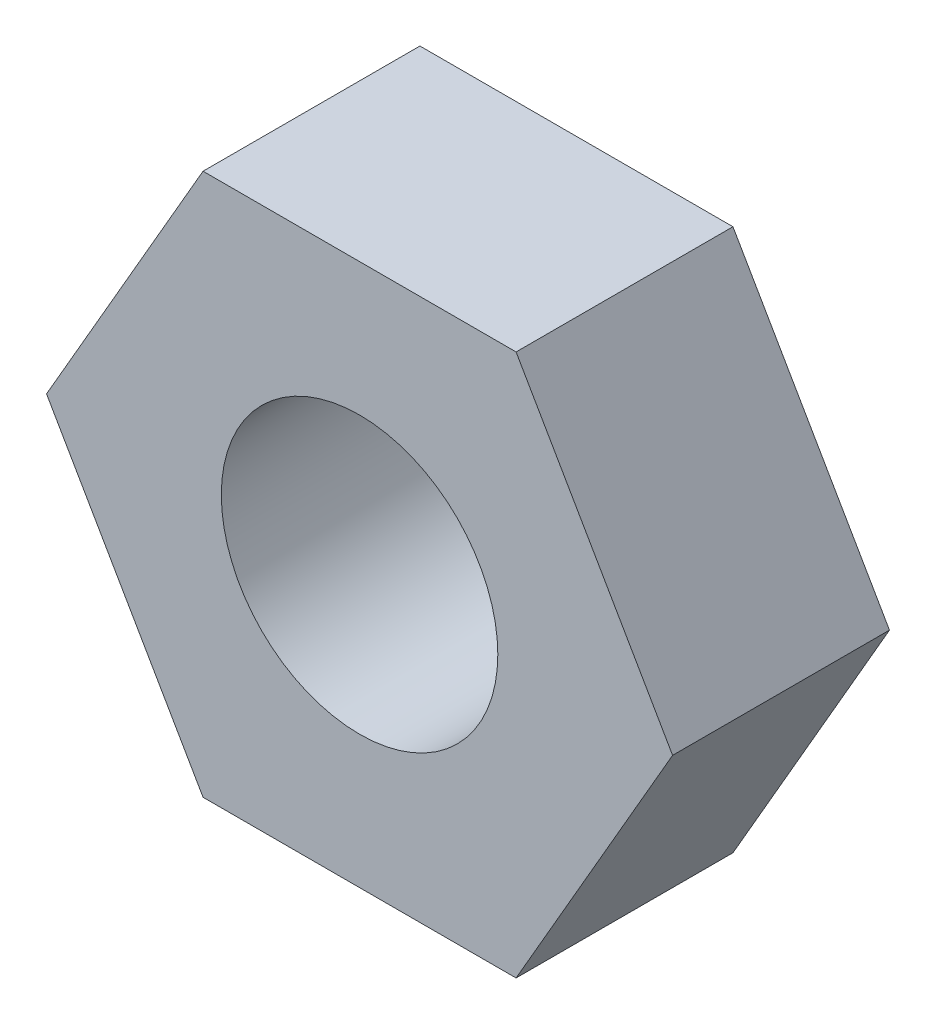
ISO-10303-21;
HEADER;
FILE_DESCRIPTION(('STEP AP214'),'2;1');
FILE_NAME('part.step','',(''),(''),'','','');
FILE_SCHEMA(('AUTOMOTIVE_DESIGN { 1 0 10303 214 1 1 1 1 }'));
ENDSEC;
DATA;
#1=APPLICATION_CONTEXT('core data for automotive mechanical design processes');
#2=APPLICATION_PROTOCOL_DEFINITION('international standard','automotive_design',2000,#1);
#3=PRODUCT_CONTEXT('',#1,'mechanical');
#4=PRODUCT('Part','Part','',(#3));
#5=PRODUCT_RELATED_PRODUCT_CATEGORY('part','',(#4));
#6=PRODUCT_DEFINITION_FORMATION('','',#4);
#7=PRODUCT_DEFINITION_CONTEXT('part definition',#1,'design');
#8=PRODUCT_DEFINITION('design','',#6,#7);
#9=PRODUCT_DEFINITION_SHAPE('','',#8);
#10=(LENGTH_UNIT() NAMED_UNIT(*) SI_UNIT(.MILLI.,.METRE.));
#11=(NAMED_UNIT(*) PLANE_ANGLE_UNIT() SI_UNIT($,.RADIAN.));
#12=(NAMED_UNIT(*) SI_UNIT($,.STERADIAN.) SOLID_ANGLE_UNIT());
#13=UNCERTAINTY_MEASURE_WITH_UNIT(LENGTH_MEASURE(1.E-05),#10,'distance_accuracy_value','');
#14=(GEOMETRIC_REPRESENTATION_CONTEXT(3) GLOBAL_UNCERTAINTY_ASSIGNED_CONTEXT((#13)) GLOBAL_UNIT_ASSIGNED_CONTEXT((#10,
#11,#12)) REPRESENTATION_CONTEXT('',''));
#15=CARTESIAN_POINT('',(0.,0.,0.));
#16=DIRECTION('',(0.,0.,1.));
#17=DIRECTION('',(1.,0.,0.));
#18=AXIS2_PLACEMENT_3D('',#15,#16,#17);
#19=CARTESIAN_POINT('',(1.15470053837925,-2.,1.6));
#20=DIRECTION('',(-0.866025403784439,0.5,0.));
#21=DIRECTION('',(-0.5,-0.866025403784439,0.));
#22=AXIS2_PLACEMENT_3D('',#19,#20,#21);
#23=PLANE('',#22);
#24=DIRECTION('',(0.5,0.866025403784439,0.));
#25=VECTOR('',#24,1.);
#26=CARTESIAN_POINT('',(1.15470053837925,-2.,0.));
#27=LINE('',#26,#25);
#28=CARTESIAN_POINT('',(1.15470053837925,-2.,0.));
#29=VERTEX_POINT('',#28);
#30=CARTESIAN_POINT('',(2.3094010767585,0.,0.));
#31=VERTEX_POINT('',#30);
#32=EDGE_CURVE('E128',#29,#31,#27,.T.);
#33=ORIENTED_EDGE('',*,*,#32,.T.);
#34=DIRECTION('',(0.,0.,-1.));
#35=VECTOR('',#34,1.);
#36=CARTESIAN_POINT('',(2.3094010767585,0.,1.6));
#37=LINE('',#36,#35);
#38=CARTESIAN_POINT('',(2.3094010767585,0.,1.6));
#39=VERTEX_POINT('',#38);
#40=EDGE_CURVE('E11',#39,#31,#37,.T.);
#41=ORIENTED_EDGE('',*,*,#40,.F.);
#42=DIRECTION('',(0.5,0.866025403784439,0.));
#43=VECTOR('',#42,1.);
#44=CARTESIAN_POINT('',(1.15470053837925,-2.,1.6));
#45=LINE('',#44,#43);
#46=CARTESIAN_POINT('',(1.15470053837925,-2.,1.6));
#47=VERTEX_POINT('',#46);
#48=EDGE_CURVE('E139',#47,#39,#45,.T.);
#49=ORIENTED_EDGE('',*,*,#48,.F.);
#50=DIRECTION('',(0.,0.,-1.));
#51=VECTOR('',#50,1.);
#52=CARTESIAN_POINT('',(1.15470053837925,-2.,1.6));
#53=LINE('',#52,#51);
#54=EDGE_CURVE('E124',#47,#29,#53,.T.);
#55=ORIENTED_EDGE('',*,*,#54,.T.);
#56=EDGE_LOOP('',(#33,#41,#49,#55));
#57=FACE_BOUND('',#56,.T.);
#58=ADVANCED_FACE('F43',(#57),#23,.F.);
#59=CARTESIAN_POINT('',(2.3094010767585,0.,1.6));
#60=DIRECTION('',(-0.866025403784439,-0.5,0.));
#61=DIRECTION('',(0.5,-0.866025403784439,0.));
#62=AXIS2_PLACEMENT_3D('',#59,#60,#61);
#63=PLANE('',#62);
#64=DIRECTION('',(-0.5,0.866025403784439,0.));
#65=VECTOR('',#64,1.);
#66=CARTESIAN_POINT('',(2.3094010767585,0.,0.));
#67=LINE('',#66,#65);
#68=CARTESIAN_POINT('',(1.15470053837925,2.,0.));
#69=VERTEX_POINT('',#68);
#70=EDGE_CURVE('E131',#31,#69,#67,.T.);
#71=ORIENTED_EDGE('',*,*,#70,.T.);
#72=DIRECTION('',(0.,0.,-1.));
#73=VECTOR('',#72,1.);
#74=CARTESIAN_POINT('',(1.15470053837925,2.,1.6));
#75=LINE('',#74,#73);
#76=CARTESIAN_POINT('',(1.15470053837925,2.,1.6));
#77=VERTEX_POINT('',#76);
#78=EDGE_CURVE('E52',#77,#69,#75,.T.);
#79=ORIENTED_EDGE('',*,*,#78,.F.);
#80=DIRECTION('',(-0.5,0.866025403784439,0.));
#81=VECTOR('',#80,1.);
#82=CARTESIAN_POINT('',(2.3094010767585,0.,1.6));
#83=LINE('',#82,#81);
#84=EDGE_CURVE('E97',#39,#77,#83,.T.);
#85=ORIENTED_EDGE('',*,*,#84,.F.);
#86=ORIENTED_EDGE('',*,*,#40,.T.);
#87=EDGE_LOOP('',(#71,#79,#85,#86));
#88=FACE_BOUND('',#87,.T.);
#89=ADVANCED_FACE('F165',(#88),#63,.F.);
#90=CARTESIAN_POINT('',(1.15470053837925,2.,1.6));
#91=DIRECTION('',(0.,-1.,0.));
#92=DIRECTION('',(1.,0.,0.));
#93=AXIS2_PLACEMENT_3D('',#90,#91,#92);
#94=PLANE('',#93);
#95=DIRECTION('',(-1.,0.,0.));
#96=VECTOR('',#95,1.);
#97=CARTESIAN_POINT('',(1.15470053837925,2.,0.));
#98=LINE('',#97,#96);
#99=CARTESIAN_POINT('',(-1.15470053837925,2.,0.));
#100=VERTEX_POINT('',#99);
#101=EDGE_CURVE('E134',#69,#100,#98,.T.);
#102=ORIENTED_EDGE('',*,*,#101,.T.);
#103=DIRECTION('',(0.,0.,-1.));
#104=VECTOR('',#103,1.);
#105=CARTESIAN_POINT('',(-1.15470053837925,2.,1.6));
#106=LINE('',#105,#104);
#107=CARTESIAN_POINT('',(-1.15470053837925,2.,1.6));
#108=VERTEX_POINT('',#107);
#109=EDGE_CURVE('E119',#108,#100,#106,.T.);
#110=ORIENTED_EDGE('',*,*,#109,.F.);
#111=DIRECTION('',(-1.,0.,0.));
#112=VECTOR('',#111,1.);
#113=CARTESIAN_POINT('',(1.15470053837925,2.,1.6));
#114=LINE('',#113,#112);
#115=EDGE_CURVE('E110',#77,#108,#114,.T.);
#116=ORIENTED_EDGE('',*,*,#115,.F.);
#117=ORIENTED_EDGE('',*,*,#78,.T.);
#118=EDGE_LOOP('',(#102,#110,#116,#117));
#119=FACE_BOUND('',#118,.T.);
#120=ADVANCED_FACE('F146',(#119),#94,.F.);
#121=CARTESIAN_POINT('',(-1.15470053837925,2.,1.6));
#122=DIRECTION('',(0.866025403784438,-0.5,0.));
#123=DIRECTION('',(0.5,0.866025403784439,0.));
#124=AXIS2_PLACEMENT_3D('',#121,#122,#123);
#125=PLANE('',#124);
#126=DIRECTION('',(-0.5,-0.866025403784438,0.));
#127=VECTOR('',#126,1.);
#128=CARTESIAN_POINT('',(-1.15470053837925,2.,0.));
#129=LINE('',#128,#127);
#130=CARTESIAN_POINT('',(-2.3094010767585,0.,0.));
#131=VERTEX_POINT('',#130);
#132=EDGE_CURVE('E118',#100,#131,#129,.T.);
#133=ORIENTED_EDGE('',*,*,#132,.T.);
#134=DIRECTION('',(0.,0.,-1.));
#135=VECTOR('',#134,1.);
#136=CARTESIAN_POINT('',(-2.3094010767585,0.,1.6));
#137=LINE('',#136,#135);
#138=CARTESIAN_POINT('',(-2.3094010767585,0.,1.6));
#139=VERTEX_POINT('',#138);
#140=EDGE_CURVE('E115',#139,#131,#137,.T.);
#141=ORIENTED_EDGE('',*,*,#140,.F.);
#142=DIRECTION('',(-0.5,-0.866025403784438,0.));
#143=VECTOR('',#142,1.);
#144=CARTESIAN_POINT('',(-1.15470053837925,2.,1.6));
#145=LINE('',#144,#143);
#146=EDGE_CURVE('E104',#108,#139,#145,.T.);
#147=ORIENTED_EDGE('',*,*,#146,.F.);
#148=ORIENTED_EDGE('',*,*,#109,.T.);
#149=EDGE_LOOP('',(#133,#141,#147,#148));
#150=FACE_BOUND('',#149,.T.);
#151=ADVANCED_FACE('F116',(#150),#125,.F.);
#152=CARTESIAN_POINT('',(-2.3094010767585,0.,1.6));
#153=DIRECTION('',(0.866025403784439,0.5,0.));
#154=DIRECTION('',(-0.5,0.866025403784439,0.));
#155=AXIS2_PLACEMENT_3D('',#152,#153,#154);
#156=PLANE('',#155);
#157=DIRECTION('',(0.5,-0.866025403784439,0.));
#158=VECTOR('',#157,1.);
#159=CARTESIAN_POINT('',(-2.3094010767585,0.,0.));
#160=LINE('',#159,#158);
#161=CARTESIAN_POINT('',(-1.15470053837925,-2.,0.));
#162=VERTEX_POINT('',#161);
#163=EDGE_CURVE('E83',#131,#162,#160,.T.);
#164=ORIENTED_EDGE('',*,*,#163,.T.);
#165=DIRECTION('',(0.,0.,-1.));
#166=VECTOR('',#165,1.);
#167=CARTESIAN_POINT('',(-1.15470053837925,-2.,1.6));
#168=LINE('',#167,#166);
#169=CARTESIAN_POINT('',(-1.15470053837925,-2.,1.6));
#170=VERTEX_POINT('',#169);
#171=EDGE_CURVE('E120',#170,#162,#168,.T.);
#172=ORIENTED_EDGE('',*,*,#171,.F.);
#173=DIRECTION('',(0.5,-0.866025403784439,0.));
#174=VECTOR('',#173,1.);
#175=CARTESIAN_POINT('',(-2.3094010767585,0.,1.6));
#176=LINE('',#175,#174);
#177=EDGE_CURVE('E108',#139,#170,#176,.T.);
#178=ORIENTED_EDGE('',*,*,#177,.F.);
#179=ORIENTED_EDGE('',*,*,#140,.T.);
#180=EDGE_LOOP('',(#164,#172,#178,#179));
#181=FACE_BOUND('',#180,.T.);
#182=ADVANCED_FACE('F122',(#181),#156,.F.);
#183=CARTESIAN_POINT('',(-1.15470053837925,-2.,1.6));
#184=DIRECTION('',(0.,1.,0.));
#185=DIRECTION('',(0.,0.,1.));
#186=AXIS2_PLACEMENT_3D('',#183,#184,#185);
#187=PLANE('',#186);
#188=DIRECTION('',(1.,0.,0.));
#189=VECTOR('',#188,1.);
#190=CARTESIAN_POINT('',(-1.15470053837925,-2.,0.));
#191=LINE('',#190,#189);
#192=EDGE_CURVE('E89',#162,#29,#191,.T.);
#193=ORIENTED_EDGE('',*,*,#192,.T.);
#194=ORIENTED_EDGE('',*,*,#54,.F.);
#195=DIRECTION('',(1.,0.,0.));
#196=VECTOR('',#195,1.);
#197=CARTESIAN_POINT('',(-1.15470053837925,-2.,1.6));
#198=LINE('',#197,#196);
#199=EDGE_CURVE('E60',#170,#47,#198,.T.);
#200=ORIENTED_EDGE('',*,*,#199,.F.);
#201=ORIENTED_EDGE('',*,*,#171,.T.);
#202=EDGE_LOOP('',(#193,#194,#200,#201));
#203=FACE_BOUND('',#202,.T.);
#204=ADVANCED_FACE('F153',(#203),#187,.F.);
#205=CARTESIAN_POINT('',(0.,0.,1.6));
#206=DIRECTION('',(0.,0.,1.));
#207=DIRECTION('',(1.,0.,0.));
#208=AXIS2_PLACEMENT_3D('',#205,#206,#207);
#209=PLANE('',#208);
#210=CARTESIAN_POINT('',(0.,0.,1.6));
#211=DIRECTION('',(0.,0.,1.));
#212=DIRECTION('',(1.,0.,0.));
#213=AXIS2_PLACEMENT_3D('',#210,#211,#212);
#214=CIRCLE('',#213,1.02);
#215=CARTESIAN_POINT('',(1.02,0.,1.6));
#216=VERTEX_POINT('',#215);
#217=EDGE_CURVE('E132',#216,#216,#214,.F.);
#218=ORIENTED_EDGE('',*,*,#217,.T.);
#219=EDGE_LOOP('',(#218));
#220=FACE_BOUND('',#219,.T.);
#221=ORIENTED_EDGE('',*,*,#48,.T.);
#222=ORIENTED_EDGE('',*,*,#84,.T.);
#223=ORIENTED_EDGE('',*,*,#115,.T.);
#224=ORIENTED_EDGE('',*,*,#146,.T.);
#225=ORIENTED_EDGE('',*,*,#177,.T.);
#226=ORIENTED_EDGE('',*,*,#199,.T.);
#227=EDGE_LOOP('',(#221,#222,#223,#224,#225,#226));
#228=FACE_BOUND('',#227,.T.);
#229=ADVANCED_FACE('F106',(#220,#228),#209,.T.);
#230=CARTESIAN_POINT('',(0.,0.,0.));
#231=DIRECTION('',(0.,0.,1.));
#232=DIRECTION('',(1.,0.,0.));
#233=AXIS2_PLACEMENT_3D('',#230,#231,#232);
#234=PLANE('',#233);
#235=CARTESIAN_POINT('',(0.,0.,0.));
#236=DIRECTION('',(0.,0.,1.));
#237=DIRECTION('',(1.,0.,0.));
#238=AXIS2_PLACEMENT_3D('',#235,#236,#237);
#239=CIRCLE('',#238,1.02);
#240=CARTESIAN_POINT('',(1.02,0.,0.));
#241=VERTEX_POINT('',#240);
#242=EDGE_CURVE('E46',#241,#241,#239,.F.);
#243=ORIENTED_EDGE('',*,*,#242,.F.);
#244=EDGE_LOOP('',(#243));
#245=FACE_BOUND('',#244,.T.);
#246=ORIENTED_EDGE('',*,*,#32,.F.);
#247=ORIENTED_EDGE('',*,*,#192,.F.);
#248=ORIENTED_EDGE('',*,*,#163,.F.);
#249=ORIENTED_EDGE('',*,*,#132,.F.);
#250=ORIENTED_EDGE('',*,*,#101,.F.);
#251=ORIENTED_EDGE('',*,*,#70,.F.);
#252=EDGE_LOOP('',(#246,#247,#248,#249,#250,#251));
#253=FACE_BOUND('',#252,.T.);
#254=ADVANCED_FACE('F149',(#245,#253),#234,.F.);
#255=CARTESIAN_POINT('',(0.,0.,2.6));
#256=DIRECTION('',(0.,0.,-1.));
#257=DIRECTION('',(-1.,0.,0.));
#258=AXIS2_PLACEMENT_3D('',#255,#256,#257);
#259=CYLINDRICAL_SURFACE('',#258,1.02);
#260=ORIENTED_EDGE('',*,*,#217,.F.);
#261=EDGE_LOOP('',(#260));
#262=FACE_BOUND('',#261,.T.);
#263=ORIENTED_EDGE('',*,*,#242,.T.);
#264=EDGE_LOOP('',(#263));
#265=FACE_BOUND('',#264,.T.);
#266=ADVANCED_FACE('F204',(#262,#265),#259,.F.);
#267=CLOSED_SHELL('',(#58,#89,#120,#151,#182,#204,#229,#254,#266));
#268=MANIFOLD_SOLID_BREP('B2',#267);
#269=ADVANCED_BREP_SHAPE_REPRESENTATION('',(#18,#268),#14);
#270=SHAPE_DEFINITION_REPRESENTATION(#9,#269);
ENDSEC;
END-ISO-10303-21;
